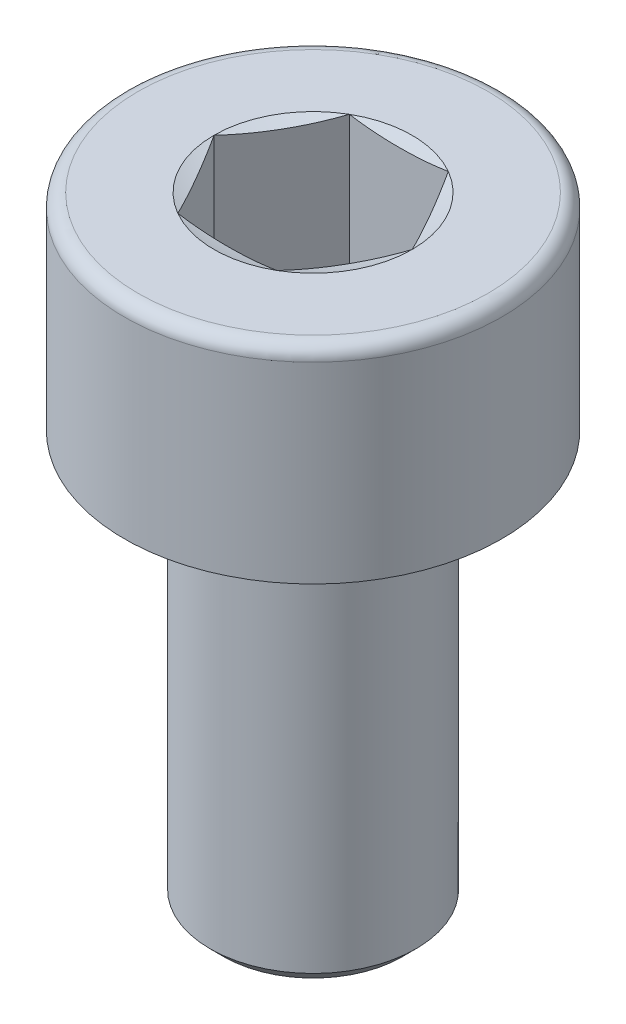
ISO-10303-21;
HEADER;
FILE_DESCRIPTION(('STEP AP214'),'2;1');
FILE_NAME('part.step','',(''),(''),'','','');
FILE_SCHEMA(('AUTOMOTIVE_DESIGN { 1 0 10303 214 1 1 1 1 }'));
ENDSEC;
DATA;
#1=APPLICATION_CONTEXT('core data for automotive mechanical design processes');
#2=APPLICATION_PROTOCOL_DEFINITION('international standard','automotive_design',2000,#1);
#3=PRODUCT_CONTEXT('',#1,'mechanical');
#4=PRODUCT('Part','Part','',(#3));
#5=PRODUCT_RELATED_PRODUCT_CATEGORY('part','',(#4));
#6=PRODUCT_DEFINITION_FORMATION('','',#4);
#7=PRODUCT_DEFINITION_CONTEXT('part definition',#1,'design');
#8=PRODUCT_DEFINITION('design','',#6,#7);
#9=PRODUCT_DEFINITION_SHAPE('','',#8);
#10=(LENGTH_UNIT() NAMED_UNIT(*) SI_UNIT(.MILLI.,.METRE.));
#11=(NAMED_UNIT(*) PLANE_ANGLE_UNIT() SI_UNIT($,.RADIAN.));
#12=(NAMED_UNIT(*) SI_UNIT($,.STERADIAN.) SOLID_ANGLE_UNIT());
#13=UNCERTAINTY_MEASURE_WITH_UNIT(LENGTH_MEASURE(1.E-05),#10,'distance_accuracy_value','');
#14=(GEOMETRIC_REPRESENTATION_CONTEXT(3) GLOBAL_UNCERTAINTY_ASSIGNED_CONTEXT((#13)) GLOBAL_UNIT_ASSIGNED_CONTEXT((#10,
#11,#12)) REPRESENTATION_CONTEXT('',''));
#15=CARTESIAN_POINT('',(0.,0.,0.));
#16=DIRECTION('',(0.,0.,1.));
#17=DIRECTION('',(1.,0.,0.));
#18=AXIS2_PLACEMENT_3D('',#15,#16,#17);
#19=CARTESIAN_POINT('',(-0.721687836487032,1.,1.25));
#20=DIRECTION('',(-0.866025403784439,0.,0.5));
#21=DIRECTION('',(0.5,0.,0.866025403784439));
#22=AXIS2_PLACEMENT_3D('',#19,#20,#21);
#23=PLANE('',#22);
#24=CARTESIAN_POINT('',(-0.721687836487033,3.,1.25));
#25=CARTESIAN_POINT('',(-0.746513124830629,2.99197238531374,1.20700133927634));
#26=CARTESIAN_POINT('',(-0.77141135372941,2.98490176746172,1.16387634180517));
#27=CARTESIAN_POINT('',(-0.821315773136171,2.97255913474823,1.07743935187044));
#28=CARTESIAN_POINT('',(-0.846321947696915,2.96728686283765,1.03412738702829));
#29=CARTESIAN_POINT('',(-0.921207679089362,2.95403550093664,0.904421495494618));
#30=CARTESIAN_POINT('',(-0.971201450687432,2.94854460534836,0.817829743024769));
#31=CARTESIAN_POINT('',(-1.05639422799085,2.94434178449894,0.670271524297353));
#32=CARTESIAN_POINT('',(-1.091578665675,2.94410115539927,0.609330290592659));
#33=CARTESIAN_POINT('',(-1.16192112047074,2.94660140173926,0.487493584957328));
#34=CARTESIAN_POINT('',(-1.19707913913524,2.94934208553123,0.426598110336958));
#35=CARTESIAN_POINT('',(-1.26754233377786,2.95799567884213,0.304552277152318));
#36=CARTESIAN_POINT('',(-1.30284686200085,2.96393024637964,0.243403040532844));
#37=CARTESIAN_POINT('',(-1.37327394982156,2.9792802908976,0.121419746198257));
#38=CARTESIAN_POINT('',(-1.40839646122585,2.98869664635053,0.0605857719566225));
#39=CARTESIAN_POINT('',(-1.44337567297406,3.,0.));
#40=B_SPLINE_CURVE_WITH_KNOTS('',3,(#24,#25,#26,#27,#28,#29,#30,#31,#32,#33,#34,#35,#36,#37,#38,
#39),.UNSPECIFIED.,.F.,.F.,(4,2,2,2,2,2,2,4),(0.,0.150861973818663,0.301702374924401,
0.601886293911623,0.812941524612172,1.02398318885367,1.23647431745907,1.44901909526101),.UNSPECIFIED.);
#41=CARTESIAN_POINT('',(-0.721687836487033,3.,1.25));
#42=VERTEX_POINT('',#41);
#43=CARTESIAN_POINT('',(-1.44337567297406,3.,0.));
#44=VERTEX_POINT('',#43);
#45=EDGE_CURVE('E81',#42,#44,#40,.T.);
#46=ORIENTED_EDGE('',*,*,#45,.F.);
#47=DIRECTION('',(0.,1.,0.));
#48=VECTOR('',#47,1.);
#49=CARTESIAN_POINT('',(-0.721687836487032,1.,1.25));
#50=LINE('',#49,#48);
#51=CARTESIAN_POINT('',(-0.721687836487032,1.,1.25));
#52=VERTEX_POINT('',#51);
#53=EDGE_CURVE('E117',#42,#52,#50,.F.);
#54=ORIENTED_EDGE('',*,*,#53,.T.);
#55=DIRECTION('',(0.5,0.,0.866025403784439));
#56=VECTOR('',#55,1.);
#57=CARTESIAN_POINT('',(-0.721687836487032,1.,1.25));
#58=LINE('',#57,#56);
#59=CARTESIAN_POINT('',(-1.44337567297406,1.,0.));
#60=VERTEX_POINT('',#59);
#61=EDGE_CURVE('E90',#60,#52,#58,.T.);
#62=ORIENTED_EDGE('',*,*,#61,.F.);
#63=DIRECTION('',(0.,1.,0.));
#64=VECTOR('',#63,1.);
#65=CARTESIAN_POINT('',(-1.44337567297406,1.,0.));
#66=LINE('',#65,#64);
#67=EDGE_CURVE('E89',#60,#44,#66,.T.);
#68=ORIENTED_EDGE('',*,*,#67,.T.);
#69=EDGE_LOOP('',(#46,#54,#62,#68));
#70=FACE_BOUND('',#69,.T.);
#71=ADVANCED_FACE('F17',(#70),#23,.F.);
#72=CARTESIAN_POINT('',(-1.44337567297406,1.,0.));
#73=DIRECTION('',(-0.866025403784439,0.,-0.5));
#74=DIRECTION('',(-0.5,0.,0.866025403784439));
#75=AXIS2_PLACEMENT_3D('',#72,#73,#74);
#76=PLANE('',#75);
#77=CARTESIAN_POINT('',(-1.44337567297406,3.,0.));
#78=CARTESIAN_POINT('',(-1.41855038463047,2.99197238531374,-0.0429986607236558));
#79=CARTESIAN_POINT('',(-1.39365215573169,2.98490176746172,-0.0861236581948247));
#80=CARTESIAN_POINT('',(-1.34374773632493,2.97255913474823,-0.172560648129561));
#81=CARTESIAN_POINT('',(-1.31874156176418,2.96728686283765,-0.215872612971707));
#82=CARTESIAN_POINT('',(-1.24385583037173,2.95403550093664,-0.345578504505382));
#83=CARTESIAN_POINT('',(-1.19386205877366,2.94854460534836,-0.432170256975232));
#84=CARTESIAN_POINT('',(-1.10866928147025,2.94434178449894,-0.579728475702647));
#85=CARTESIAN_POINT('',(-1.0734848437861,2.94410115539927,-0.640669709407341));
#86=CARTESIAN_POINT('',(-1.00314238899036,2.94660140173926,-0.762506415042673));
#87=CARTESIAN_POINT('',(-0.967984370325861,2.94934208553123,-0.823401889663042));
#88=CARTESIAN_POINT('',(-0.897521175683236,2.95799567884213,-0.945447722847683));
#89=CARTESIAN_POINT('',(-0.862216647460243,2.96393024637964,-1.00659695946716));
#90=CARTESIAN_POINT('',(-0.791789559639532,2.9792802908976,-1.12858025380174));
#91=CARTESIAN_POINT('',(-0.756667048235249,2.98869664635053,-1.18941422804338));
#92=CARTESIAN_POINT('',(-0.721687836487033,3.,-1.25));
#93=B_SPLINE_CURVE_WITH_KNOTS('',3,(#77,#78,#79,#80,#81,#82,#83,#84,#85,#86,#87,#88,#89,#90,#91,
#92),.UNSPECIFIED.,.F.,.F.,(4,2,2,2,2,2,2,4),(0.,0.150861973818663,0.301702374924401,
0.601886293911624,0.812941524612174,1.02398318885367,1.23647431745908,1.44901909526101),.UNSPECIFIED.);
#94=CARTESIAN_POINT('',(-0.721687836487031,3.,-1.25));
#95=VERTEX_POINT('',#94);
#96=EDGE_CURVE('E96',#44,#95,#93,.T.);
#97=ORIENTED_EDGE('',*,*,#96,.F.);
#98=ORIENTED_EDGE('',*,*,#67,.F.);
#99=DIRECTION('',(0.5,0.,-0.866025403784439));
#100=VECTOR('',#99,1.);
#101=CARTESIAN_POINT('',(-1.44337567297406,1.,0.));
#102=LINE('',#101,#100);
#103=CARTESIAN_POINT('',(-0.721687836487033,1.,-1.25));
#104=VERTEX_POINT('',#103);
#105=EDGE_CURVE('E228',#60,#104,#102,.T.);
#106=ORIENTED_EDGE('',*,*,#105,.T.);
#107=DIRECTION('',(0.,1.,0.));
#108=VECTOR('',#107,1.);
#109=CARTESIAN_POINT('',(-0.721687836487033,1.,-1.25));
#110=LINE('',#109,#108);
#111=EDGE_CURVE('E115',#104,#95,#110,.T.);
#112=ORIENTED_EDGE('',*,*,#111,.T.);
#113=EDGE_LOOP('',(#97,#98,#106,#112));
#114=FACE_BOUND('',#113,.T.);
#115=ADVANCED_FACE('F113',(#114),#76,.F.);
#116=CARTESIAN_POINT('',(0.721687836487032,1.,1.25));
#117=DIRECTION('',(0.,0.,1.));
#118=DIRECTION('',(1.,0.,0.));
#119=AXIS2_PLACEMENT_3D('',#116,#117,#118);
#120=PLANE('',#119);
#121=CARTESIAN_POINT('',(0.721687836487032,3.,1.25));
#122=CARTESIAN_POINT('',(0.672037259799839,2.99197238531374,1.25));
#123=CARTESIAN_POINT('',(0.622240802002277,2.98490176746172,1.25));
#124=CARTESIAN_POINT('',(0.522431963188755,2.97255913474823,1.25));
#125=CARTESIAN_POINT('',(0.472419614067266,2.96728686283765,1.25));
#126=CARTESIAN_POINT('',(0.322648151282372,2.95403550093664,1.25));
#127=CARTESIAN_POINT('',(0.222660608086233,2.94854460534836,1.25));
#128=CARTESIAN_POINT('',(0.0522750534794033,2.94434178449894,1.25));
#129=CARTESIAN_POINT('',(-0.0180938218889029,2.94410115539927,1.25));
#130=CARTESIAN_POINT('',(-0.158778731480375,2.94660140173926,1.25));
#131=CARTESIAN_POINT('',(-0.229094768809375,2.94934208553123,1.25));
#132=CARTESIAN_POINT('',(-0.370021158094624,2.95799567884213,1.25));
#133=CARTESIAN_POINT('',(-0.44063021454061,2.96393024637964,1.25));
#134=CARTESIAN_POINT('',(-0.581484390182033,2.9792802908976,1.25));
#135=CARTESIAN_POINT('',(-0.651729412990598,2.98869664635053,1.25));
#136=CARTESIAN_POINT('',(-0.721687836487032,3.,1.25));
#137=B_SPLINE_CURVE_WITH_KNOTS('',3,(#121,#122,#123,#124,#125,#126,#127,#128,#129,#130,#131,
#132,#133,#134,#135,#136),.UNSPECIFIED.,.F.,.F.,(4,2,2,2,2,2,2,4),(0.,0.150861973818663,
0.301702374924401,0.601886293911623,0.812941524612173,1.02398318885367,1.23647431745907,
1.44901909526101),.UNSPECIFIED.);
#138=CARTESIAN_POINT('',(0.72168783648703,3.,1.25));
#139=VERTEX_POINT('',#138);
#140=EDGE_CURVE('E75',#139,#42,#137,.T.);
#141=ORIENTED_EDGE('',*,*,#140,.F.);
#142=DIRECTION('',(0.,1.,0.));
#143=VECTOR('',#142,1.);
#144=CARTESIAN_POINT('',(0.721687836487031,1.,1.25));
#145=LINE('',#144,#143);
#146=CARTESIAN_POINT('',(0.721687836487032,1.,1.25));
#147=VERTEX_POINT('',#146);
#148=EDGE_CURVE('E211',#139,#147,#145,.F.);
#149=ORIENTED_EDGE('',*,*,#148,.T.);
#150=DIRECTION('',(1.,0.,0.));
#151=VECTOR('',#150,1.);
#152=CARTESIAN_POINT('',(-0.721687836487033,1.,1.25));
#153=LINE('',#152,#151);
#154=EDGE_CURVE('E232',#147,#52,#153,.F.);
#155=ORIENTED_EDGE('',*,*,#154,.T.);
#156=ORIENTED_EDGE('',*,*,#53,.F.);
#157=EDGE_LOOP('',(#141,#149,#155,#156));
#158=FACE_BOUND('',#157,.T.);
#159=ADVANCED_FACE('F138',(#158),#120,.F.);
#160=CARTESIAN_POINT('',(-0.721687836487033,1.,-1.25));
#161=DIRECTION('',(0.,-1.,0.));
#162=DIRECTION('',(0.,0.,-1.));
#163=AXIS2_PLACEMENT_3D('',#160,#161,#162);
#164=PLANE('',#163);
#165=ORIENTED_EDGE('',*,*,#61,.T.);
#166=ORIENTED_EDGE('',*,*,#154,.F.);
#167=DIRECTION('',(0.5,0.,-0.866025403784439));
#168=VECTOR('',#167,1.);
#169=CARTESIAN_POINT('',(1.44337567297406,1.,0.));
#170=LINE('',#169,#168);
#171=CARTESIAN_POINT('',(1.44337567297406,1.,0.));
#172=VERTEX_POINT('',#171);
#173=EDGE_CURVE('E160',#147,#172,#170,.T.);
#174=ORIENTED_EDGE('',*,*,#173,.T.);
#175=DIRECTION('',(-0.5,0.,-0.866025403784439));
#176=VECTOR('',#175,1.);
#177=CARTESIAN_POINT('',(0.721687836487033,1.,-1.25));
#178=LINE('',#177,#176);
#179=CARTESIAN_POINT('',(0.721687836487033,1.,-1.25));
#180=VERTEX_POINT('',#179);
#181=EDGE_CURVE('E208',#172,#180,#178,.T.);
#182=ORIENTED_EDGE('',*,*,#181,.T.);
#183=DIRECTION('',(-1.,0.,0.));
#184=VECTOR('',#183,1.);
#185=CARTESIAN_POINT('',(-0.721687836487033,1.,-1.25));
#186=LINE('',#185,#184);
#187=EDGE_CURVE('E223',#180,#104,#186,.T.);
#188=ORIENTED_EDGE('',*,*,#187,.T.);
#189=ORIENTED_EDGE('',*,*,#105,.F.);
#190=EDGE_LOOP('',(#165,#166,#174,#182,#188,#189));
#191=FACE_BOUND('',#190,.T.);
#192=ADVANCED_FACE('F142',(#191),#164,.F.);
#193=CARTESIAN_POINT('',(-0.721687836487033,1.,-1.25));
#194=DIRECTION('',(0.,0.,-1.));
#195=DIRECTION('',(-1.,0.,0.));
#196=AXIS2_PLACEMENT_3D('',#193,#194,#195);
#197=PLANE('',#196);
#198=CARTESIAN_POINT('',(-0.721687836487031,3.,-1.25));
#199=CARTESIAN_POINT('',(-0.672037259799838,2.99197238531374,-1.25));
#200=CARTESIAN_POINT('',(-0.622240802002276,2.98490176746172,-1.25));
#201=CARTESIAN_POINT('',(-0.522431963188754,2.97255913474823,-1.25));
#202=CARTESIAN_POINT('',(-0.472419614067265,2.96728686283765,-1.25));
#203=CARTESIAN_POINT('',(-0.322648151282371,2.95403550093664,-1.25));
#204=CARTESIAN_POINT('',(-0.222660608086232,2.94854460534836,-1.25));
#205=CARTESIAN_POINT('',(-0.0522750534794021,2.94434178449894,-1.25));
#206=CARTESIAN_POINT('',(0.0180938218889041,2.94410115539927,-1.25));
#207=CARTESIAN_POINT('',(0.158778731480376,2.94660140173926,-1.25));
#208=CARTESIAN_POINT('',(0.229094768809376,2.94934208553123,-1.25));
#209=CARTESIAN_POINT('',(0.370021158094625,2.95799567884213,-1.25));
#210=CARTESIAN_POINT('',(0.440630214540611,2.96393024637964,-1.25));
#211=CARTESIAN_POINT('',(0.581484390182035,2.9792802908976,-1.25));
#212=CARTESIAN_POINT('',(0.651729412990599,2.98869664635053,-1.25));
#213=CARTESIAN_POINT('',(0.721687836487033,3.,-1.25));
#214=B_SPLINE_CURVE_WITH_KNOTS('',3,(#198,#199,#200,#201,#202,#203,#204,#205,#206,#207,#208,
#209,#210,#211,#212,#213),.UNSPECIFIED.,.F.,.F.,(4,2,2,2,2,2,2,4),(0.,0.150861973818663,
0.301702374924401,0.601886293911623,0.812941524612173,1.02398318885367,1.23647431745907,
1.44901909526101),.UNSPECIFIED.);
#215=CARTESIAN_POINT('',(0.721687836487033,3.,-1.25));
#216=VERTEX_POINT('',#215);
#217=EDGE_CURVE('E155',#95,#216,#214,.T.);
#218=ORIENTED_EDGE('',*,*,#217,.F.);
#219=ORIENTED_EDGE('',*,*,#111,.F.);
#220=ORIENTED_EDGE('',*,*,#187,.F.);
#221=DIRECTION('',(0.,1.,0.));
#222=VECTOR('',#221,1.);
#223=CARTESIAN_POINT('',(0.721687836487033,1.,-1.25));
#224=LINE('',#223,#222);
#225=EDGE_CURVE('E203',#180,#216,#224,.T.);
#226=ORIENTED_EDGE('',*,*,#225,.T.);
#227=EDGE_LOOP('',(#218,#219,#220,#226));
#228=FACE_BOUND('',#227,.T.);
#229=ADVANCED_FACE('F146',(#228),#197,.F.);
#230=CARTESIAN_POINT('',(1.44337567297406,1.,0.));
#231=DIRECTION('',(0.866025403784439,0.,0.5));
#232=DIRECTION('',(0.5,0.,-0.866025403784439));
#233=AXIS2_PLACEMENT_3D('',#230,#231,#232);
#234=PLANE('',#233);
#235=CARTESIAN_POINT('',(1.44337567297406,3.,0.));
#236=CARTESIAN_POINT('',(1.41855038463047,2.99197238531374,0.0429986607236575));
#237=CARTESIAN_POINT('',(1.39365215573169,2.98490176746172,0.0861236581948263));
#238=CARTESIAN_POINT('',(1.34374773632493,2.97255913474823,0.172560648129562));
#239=CARTESIAN_POINT('',(1.31874156176418,2.96728686283765,0.215872612971708));
#240=CARTESIAN_POINT('',(1.24385583037173,2.95403550093664,0.345578504505383));
#241=CARTESIAN_POINT('',(1.19386205877366,2.94854460534836,0.432170256975233));
#242=CARTESIAN_POINT('',(1.10866928147025,2.94434178449894,0.579728475702648));
#243=CARTESIAN_POINT('',(1.0734848437861,2.94410115539927,0.640669709407342));
#244=CARTESIAN_POINT('',(1.00314238899036,2.94660140173926,0.762506415042673));
#245=CARTESIAN_POINT('',(0.96798437032586,2.94934208553123,0.823401889663042));
#246=CARTESIAN_POINT('',(0.897521175683236,2.95799567884213,0.945447722847683));
#247=CARTESIAN_POINT('',(0.862216647460243,2.96393024637964,1.00659695946716));
#248=CARTESIAN_POINT('',(0.791789559639532,2.9792802908976,1.12858025380174));
#249=CARTESIAN_POINT('',(0.756667048235249,2.98869664635053,1.18941422804338));
#250=CARTESIAN_POINT('',(0.721687836487032,3.,1.25));
#251=B_SPLINE_CURVE_WITH_KNOTS('',3,(#235,#236,#237,#238,#239,#240,#241,#242,#243,#244,#245,
#246,#247,#248,#249,#250),.UNSPECIFIED.,.F.,.F.,(4,2,2,2,2,2,2,4),(0.,0.150861973818663,
0.301702374924401,0.601886293911623,0.812941524612172,1.02398318885367,1.23647431745907,
1.449019095261),.UNSPECIFIED.);
#252=CARTESIAN_POINT('',(1.44337567297406,3.,0.));
#253=VERTEX_POINT('',#252);
#254=EDGE_CURVE('E161',#253,#139,#251,.T.);
#255=ORIENTED_EDGE('',*,*,#254,.F.);
#256=DIRECTION('',(0.,1.,0.));
#257=VECTOR('',#256,1.);
#258=CARTESIAN_POINT('',(1.44337567297407,1.,0.));
#259=LINE('',#258,#257);
#260=EDGE_CURVE('E199',#253,#172,#259,.F.);
#261=ORIENTED_EDGE('',*,*,#260,.T.);
#262=ORIENTED_EDGE('',*,*,#173,.F.);
#263=ORIENTED_EDGE('',*,*,#148,.F.);
#264=EDGE_LOOP('',(#255,#261,#262,#263));
#265=FACE_BOUND('',#264,.T.);
#266=ADVANCED_FACE('F151',(#265),#234,.F.);
#267=CARTESIAN_POINT('',(0.721687836487033,1.,-1.25));
#268=DIRECTION('',(0.866025403784439,0.,-0.5));
#269=DIRECTION('',(-0.5,0.,-0.866025403784439));
#270=AXIS2_PLACEMENT_3D('',#267,#268,#269);
#271=PLANE('',#270);
#272=CARTESIAN_POINT('',(1.44337567297407,3.,0.));
#273=CARTESIAN_POINT('',(1.41855038463047,2.99197238531374,-0.0429986607236545));
#274=CARTESIAN_POINT('',(1.39365215573169,2.98490176746172,-0.0861236581948233));
#275=CARTESIAN_POINT('',(1.34374773632493,2.97255913474823,-0.172560648129559));
#276=CARTESIAN_POINT('',(1.31874156176418,2.96728686283765,-0.215872612971705));
#277=CARTESIAN_POINT('',(1.24385583037174,2.95403550093664,-0.34557850450538));
#278=CARTESIAN_POINT('',(1.19386205877367,2.94854460534836,-0.43217025697523));
#279=CARTESIAN_POINT('',(1.10866928147025,2.94434178449894,-0.579728475702645));
#280=CARTESIAN_POINT('',(1.0734848437861,2.94410115539927,-0.640669709407339));
#281=CARTESIAN_POINT('',(1.00314238899036,2.94660140173926,-0.76250641504267));
#282=CARTESIAN_POINT('',(0.967984370325862,2.94934208553123,-0.82340188966304));
#283=CARTESIAN_POINT('',(0.897521175683238,2.95799567884213,-0.945447722847681));
#284=CARTESIAN_POINT('',(0.862216647460245,2.96393024637964,-1.00659695946715));
#285=CARTESIAN_POINT('',(0.791789559639533,2.9792802908976,-1.12858025380174));
#286=CARTESIAN_POINT('',(0.756667048235251,2.98869664635053,-1.18941422804338));
#287=CARTESIAN_POINT('',(0.721687836487034,3.,-1.25));
#288=B_SPLINE_CURVE_WITH_KNOTS('',3,(#272,#273,#274,#275,#276,#277,#278,#279,#280,#281,#282,
#283,#284,#285,#286,#287),.UNSPECIFIED.,.F.,.F.,(4,2,2,2,2,2,2,4),(0.,0.150861973818663,
0.301702374924401,0.601886293911622,0.812941524612173,1.02398318885367,1.23647431745907,
1.44901909526101),.UNSPECIFIED.);
#289=EDGE_CURVE('E202',#253,#216,#288,.T.);
#290=ORIENTED_EDGE('',*,*,#289,.T.);
#291=ORIENTED_EDGE('',*,*,#225,.F.);
#292=ORIENTED_EDGE('',*,*,#181,.F.);
#293=ORIENTED_EDGE('',*,*,#260,.F.);
#294=EDGE_LOOP('',(#290,#291,#292,#293));
#295=FACE_BOUND('',#294,.T.);
#296=ADVANCED_FACE('F194',(#295),#271,.F.);
#297=CARTESIAN_POINT('',(-0.520457544102291,5.85450908693594,0.));
#298=DIRECTION('',(0.,0.,1.));
#299=DIRECTION('',(-1.,0.,0.));
#300=AXIS2_PLACEMENT_3D('',#297,#298,#299);
#301=CIRCLE('',#300,3.);
#302=TRIMMED_CURVE('',#301,(PARAMETER_VALUE(-1.74516442055986)),
(PARAMETER_VALUE(1.74516442055986)),.T.,.PARAMETER.);
#303=CARTESIAN_POINT('',(0.,5.85450908693594,0.));
#304=DIRECTION('',(0.,1.,0.));
#305=AXIS1_PLACEMENT('',#303,#304);
#306=SURFACE_OF_REVOLUTION('',#302,#305);
#307=ORIENTED_EDGE('',*,*,#254,.T.);
#308=CARTESIAN_POINT('',(0.,3.,0.));
#309=DIRECTION('',(0.,1.,0.));
#310=DIRECTION('',(-1.,0.,0.));
#311=AXIS2_PLACEMENT_3D('',#308,#309,#310);
#312=CIRCLE('',#311,1.44337567297406);
#313=EDGE_CURVE('E259',#253,#139,#312,.F.);
#314=ORIENTED_EDGE('',*,*,#313,.F.);
#315=EDGE_LOOP('',(#307,#314));
#316=FACE_BOUND('',#315,.T.);
#317=ADVANCED_FACE('F191',(#316),#306,.T.);
#318=CARTESIAN_POINT('',(-0.520457544102291,5.85450908693594,0.));
#319=DIRECTION('',(0.,0.,1.));
#320=DIRECTION('',(-1.,0.,0.));
#321=AXIS2_PLACEMENT_3D('',#318,#319,#320);
#322=CIRCLE('',#321,3.);
#323=TRIMMED_CURVE('',#322,(PARAMETER_VALUE(-1.74516442055986)),
(PARAMETER_VALUE(1.74516442055986)),.T.,.PARAMETER.);
#324=CARTESIAN_POINT('',(0.,5.85450908693594,0.));
#325=DIRECTION('',(0.,1.,0.));
#326=AXIS1_PLACEMENT('',#324,#325);
#327=SURFACE_OF_REVOLUTION('',#323,#326);
#328=ORIENTED_EDGE('',*,*,#140,.T.);
#329=CARTESIAN_POINT('',(0.,3.,0.));
#330=DIRECTION('',(0.,1.,0.));
#331=DIRECTION('',(-1.,0.,0.));
#332=AXIS2_PLACEMENT_3D('',#329,#330,#331);
#333=CIRCLE('',#332,1.44337567297406);
#334=EDGE_CURVE('E106',#139,#42,#333,.F.);
#335=ORIENTED_EDGE('',*,*,#334,.F.);
#336=EDGE_LOOP('',(#328,#335));
#337=FACE_BOUND('',#336,.T.);
#338=ADVANCED_FACE('F188',(#337),#327,.T.);
#339=CARTESIAN_POINT('',(-0.520457544102291,5.85450908693594,0.));
#340=DIRECTION('',(0.,0.,1.));
#341=DIRECTION('',(-1.,0.,0.));
#342=AXIS2_PLACEMENT_3D('',#339,#340,#341);
#343=CIRCLE('',#342,3.);
#344=TRIMMED_CURVE('',#343,(PARAMETER_VALUE(-1.74516442055986)),
(PARAMETER_VALUE(1.74516442055986)),.T.,.PARAMETER.);
#345=CARTESIAN_POINT('',(0.,5.85450908693594,0.));
#346=DIRECTION('',(0.,1.,0.));
#347=AXIS1_PLACEMENT('',#345,#346);
#348=SURFACE_OF_REVOLUTION('',#344,#347);
#349=ORIENTED_EDGE('',*,*,#45,.T.);
#350=CARTESIAN_POINT('',(0.,3.,0.));
#351=DIRECTION('',(0.,1.,0.));
#352=DIRECTION('',(-1.,0.,0.));
#353=AXIS2_PLACEMENT_3D('',#350,#351,#352);
#354=CIRCLE('',#353,1.44337567297406);
#355=EDGE_CURVE('E85',#42,#44,#354,.F.);
#356=ORIENTED_EDGE('',*,*,#355,.F.);
#357=EDGE_LOOP('',(#349,#356));
#358=FACE_BOUND('',#357,.T.);
#359=ADVANCED_FACE('F83',(#358),#348,.T.);
#360=CARTESIAN_POINT('',(-0.520457544102291,5.85450908693594,0.));
#361=DIRECTION('',(0.,0.,1.));
#362=DIRECTION('',(-1.,0.,0.));
#363=AXIS2_PLACEMENT_3D('',#360,#361,#362);
#364=CIRCLE('',#363,3.);
#365=TRIMMED_CURVE('',#364,(PARAMETER_VALUE(-1.74516442055986)),
(PARAMETER_VALUE(1.74516442055986)),.T.,.PARAMETER.);
#366=CARTESIAN_POINT('',(0.,5.85450908693594,0.));
#367=DIRECTION('',(0.,1.,0.));
#368=AXIS1_PLACEMENT('',#366,#367);
#369=SURFACE_OF_REVOLUTION('',#365,#368);
#370=ORIENTED_EDGE('',*,*,#96,.T.);
#371=CARTESIAN_POINT('',(0.,3.,0.));
#372=DIRECTION('',(0.,1.,0.));
#373=DIRECTION('',(-1.,0.,0.));
#374=AXIS2_PLACEMENT_3D('',#371,#372,#373);
#375=CIRCLE('',#374,1.44337567297406);
#376=EDGE_CURVE('E103',#44,#95,#375,.F.);
#377=ORIENTED_EDGE('',*,*,#376,.F.);
#378=EDGE_LOOP('',(#370,#377));
#379=FACE_BOUND('',#378,.T.);
#380=ADVANCED_FACE('F109',(#379),#369,.T.);
#381=CARTESIAN_POINT('',(-0.520457544102291,5.85450908693594,0.));
#382=DIRECTION('',(0.,0.,1.));
#383=DIRECTION('',(-1.,0.,0.));
#384=AXIS2_PLACEMENT_3D('',#381,#382,#383);
#385=CIRCLE('',#384,3.);
#386=TRIMMED_CURVE('',#385,(PARAMETER_VALUE(-1.74516442055986)),
(PARAMETER_VALUE(1.74516442055986)),.T.,.PARAMETER.);
#387=CARTESIAN_POINT('',(0.,5.85450908693594,0.));
#388=DIRECTION('',(0.,1.,0.));
#389=AXIS1_PLACEMENT('',#387,#388);
#390=SURFACE_OF_REVOLUTION('',#386,#389);
#391=ORIENTED_EDGE('',*,*,#217,.T.);
#392=CARTESIAN_POINT('',(0.,3.,0.));
#393=DIRECTION('',(0.,1.,0.));
#394=DIRECTION('',(-1.,0.,0.));
#395=AXIS2_PLACEMENT_3D('',#392,#393,#394);
#396=CIRCLE('',#395,1.44337567297406);
#397=EDGE_CURVE('E111',#95,#216,#396,.F.);
#398=ORIENTED_EDGE('',*,*,#397,.F.);
#399=EDGE_LOOP('',(#391,#398));
#400=FACE_BOUND('',#399,.T.);
#401=ADVANCED_FACE('F167',(#400),#390,.T.);
#402=CARTESIAN_POINT('',(-0.520457544102291,5.85450908693594,0.));
#403=DIRECTION('',(0.,0.,1.));
#404=DIRECTION('',(-1.,0.,0.));
#405=AXIS2_PLACEMENT_3D('',#402,#403,#404);
#406=CIRCLE('',#405,3.);
#407=TRIMMED_CURVE('',#406,(PARAMETER_VALUE(-1.74516442055986)),
(PARAMETER_VALUE(1.74516442055986)),.T.,.PARAMETER.);
#408=CARTESIAN_POINT('',(0.,5.85450908693594,0.));
#409=DIRECTION('',(0.,1.,0.));
#410=AXIS1_PLACEMENT('',#408,#409);
#411=SURFACE_OF_REVOLUTION('',#407,#410);
#412=ORIENTED_EDGE('',*,*,#289,.F.);
#413=CARTESIAN_POINT('',(0.,3.,0.));
#414=DIRECTION('',(0.,1.,0.));
#415=DIRECTION('',(-1.,0.,0.));
#416=AXIS2_PLACEMENT_3D('',#413,#414,#415);
#417=CIRCLE('',#416,1.44337567297406);
#418=EDGE_CURVE('E254',#216,#253,#417,.F.);
#419=ORIENTED_EDGE('',*,*,#418,.F.);
#420=EDGE_LOOP('',(#412,#419));
#421=FACE_BOUND('',#420,.T.);
#422=ADVANCED_FACE('F172',(#421),#411,.T.);
#423=CARTESIAN_POINT('',(0.,3.,0.));
#424=DIRECTION('',(0.,1.,0.));
#425=DIRECTION('',(0.,0.,1.));
#426=AXIS2_PLACEMENT_3D('',#423,#424,#425);
#427=PLANE('',#426);
#428=CARTESIAN_POINT('',(0.,3.,0.));
#429=DIRECTION('',(0.,-1.,0.));
#430=DIRECTION('',(0.,0.,-1.));
#431=AXIS2_PLACEMENT_3D('',#428,#429,#430);
#432=CIRCLE('',#431,2.55);
#433=CARTESIAN_POINT('',(0.,3.,-2.55));
#434=VERTEX_POINT('',#433);
#435=CARTESIAN_POINT('',(0.,3.,2.55));
#436=VERTEX_POINT('',#435);
#437=EDGE_CURVE('E37',#434,#436,#432,.T.);
#438=ORIENTED_EDGE('',*,*,#437,.F.);
#439=CARTESIAN_POINT('',(0.,3.,0.));
#440=DIRECTION('',(0.,-1.,0.));
#441=DIRECTION('',(0.,0.,1.));
#442=AXIS2_PLACEMENT_3D('',#439,#440,#441);
#443=CIRCLE('',#442,2.55);
#444=EDGE_CURVE('E327',#436,#434,#443,.T.);
#445=ORIENTED_EDGE('',*,*,#444,.F.);
#446=EDGE_LOOP('',(#438,#445));
#447=FACE_BOUND('',#446,.T.);
#448=ORIENTED_EDGE('',*,*,#397,.T.);
#449=ORIENTED_EDGE('',*,*,#418,.T.);
#450=ORIENTED_EDGE('',*,*,#313,.T.);
#451=ORIENTED_EDGE('',*,*,#334,.T.);
#452=ORIENTED_EDGE('',*,*,#355,.T.);
#453=ORIENTED_EDGE('',*,*,#376,.T.);
#454=EDGE_LOOP('',(#448,#449,#450,#451,#452,#453));
#455=FACE_BOUND('',#454,.T.);
#456=ADVANCED_FACE('F102',(#447,#455),#427,.T.);
#457=CARTESIAN_POINT('',(0.,2.8,0.));
#458=DIRECTION('',(0.,1.,0.));
#459=DIRECTION('',(0.,0.,1.));
#460=AXIS2_PLACEMENT_3D('',#457,#458,#459);
#461=TOROIDAL_SURFACE('',#460,2.55,0.2);
#462=CARTESIAN_POINT('',(0.,2.8,0.));
#463=DIRECTION('',(0.,-1.,0.));
#464=DIRECTION('',(0.,0.,-1.));
#465=AXIS2_PLACEMENT_3D('',#462,#463,#464);
#466=CIRCLE('',#465,2.75);
#467=CARTESIAN_POINT('',(0.,2.8,-2.75));
#468=VERTEX_POINT('',#467);
#469=EDGE_CURVE('E253',#468,#468,#466,.T.);
#470=ORIENTED_EDGE('',*,*,#469,.F.);
#471=EDGE_LOOP('',(#470));
#472=FACE_BOUND('',#471,.T.);
#473=ORIENTED_EDGE('',*,*,#444,.T.);
#474=ORIENTED_EDGE('',*,*,#437,.T.);
#475=EDGE_LOOP('',(#473,#474));
#476=FACE_BOUND('',#475,.T.);
#477=ADVANCED_FACE('F304',(#472,#476),#461,.T.);
#478=CARTESIAN_POINT('',(0.,-6.,0.));
#479=DIRECTION('',(0.,-1.,0.));
#480=DIRECTION('',(0.,0.,-1.));
#481=AXIS2_PLACEMENT_3D('',#478,#479,#480);
#482=PLANE('',#481);
#483=CARTESIAN_POINT('',(0.,-5.99999999997181,0.));
#484=DIRECTION('',(0.,1.,0.));
#485=DIRECTION('',(0.,0.,1.));
#486=AXIS2_PLACEMENT_3D('',#483,#484,#485);
#487=CIRCLE('',#486,1.29999999995789);
#488=CARTESIAN_POINT('',(0.,-5.99999999997181,1.29999999995789));
#489=VERTEX_POINT('',#488);
#490=EDGE_CURVE('E250',#489,#489,#487,.T.);
#491=ORIENTED_EDGE('',*,*,#490,.F.);
#492=EDGE_LOOP('',(#491));
#493=FACE_BOUND('',#492,.T.);
#494=ADVANCED_FACE('F301',(#493),#482,.T.);
#495=CARTESIAN_POINT('',(0.,3.,0.));
#496=DIRECTION('',(0.,-1.,0.));
#497=DIRECTION('',(0.,0.,-1.));
#498=AXIS2_PLACEMENT_3D('',#495,#496,#497);
#499=CYLINDRICAL_SURFACE('',#498,2.75);
#500=ORIENTED_EDGE('',*,*,#469,.T.);
#501=EDGE_LOOP('',(#500));
#502=FACE_BOUND('',#501,.T.);
#503=CARTESIAN_POINT('',(0.,0.,0.));
#504=DIRECTION('',(0.,-1.,0.));
#505=DIRECTION('',(0.,0.,-1.));
#506=AXIS2_PLACEMENT_3D('',#503,#504,#505);
#507=CIRCLE('',#506,2.75);
#508=CARTESIAN_POINT('',(0.,0.,-2.75));
#509=VERTEX_POINT('',#508);
#510=EDGE_CURVE('E247',#509,#509,#507,.F.);
#511=ORIENTED_EDGE('',*,*,#510,.T.);
#512=EDGE_LOOP('',(#511));
#513=FACE_BOUND('',#512,.T.);
#514=ADVANCED_FACE('F297',(#502,#513),#499,.T.);
#515=CARTESIAN_POINT('',(0.,-5.80000000002201,0.));
#516=DIRECTION('',(0.,1.,0.));
#517=DIRECTION('',(0.,0.,1.));
#518=AXIS2_PLACEMENT_3D('',#515,#516,#517);
#519=CONICAL_SURFACE('',#518,1.49999999990769,0.785398163397448);
#520=CARTESIAN_POINT('',(0.,-5.8,0.));
#521=DIRECTION('',(0.,1.,0.));
#522=DIRECTION('',(0.,0.,1.));
#523=AXIS2_PLACEMENT_3D('',#520,#521,#522);
#524=CIRCLE('',#523,1.5);
#525=CARTESIAN_POINT('',(0.,-5.8,1.5));
#526=VERTEX_POINT('',#525);
#527=EDGE_CURVE('E29',#526,#526,#524,.T.);
#528=ORIENTED_EDGE('',*,*,#527,.F.);
#529=EDGE_LOOP('',(#528));
#530=FACE_BOUND('',#529,.T.);
#531=ORIENTED_EDGE('',*,*,#490,.T.);
#532=EDGE_LOOP('',(#531));
#533=FACE_BOUND('',#532,.T.);
#534=ADVANCED_FACE('F290',(#530,#533),#519,.T.);
#535=CARTESIAN_POINT('',(0.,0.,0.));
#536=DIRECTION('',(0.,1.,0.));
#537=DIRECTION('',(0.,0.,1.));
#538=AXIS2_PLACEMENT_3D('',#535,#536,#537);
#539=PLANE('',#538);
#540=CARTESIAN_POINT('',(0.,0.,0.));
#541=DIRECTION('',(0.,1.,0.));
#542=DIRECTION('',(0.,0.,1.));
#543=AXIS2_PLACEMENT_3D('',#540,#541,#542);
#544=CIRCLE('',#543,1.5);
#545=CARTESIAN_POINT('',(0.,0.,1.5));
#546=VERTEX_POINT('',#545);
#547=EDGE_CURVE('E11',#546,#546,#544,.F.);
#548=ORIENTED_EDGE('',*,*,#547,.F.);
#549=EDGE_LOOP('',(#548));
#550=FACE_BOUND('',#549,.T.);
#551=ORIENTED_EDGE('',*,*,#510,.F.);
#552=EDGE_LOOP('',(#551));
#553=FACE_BOUND('',#552,.T.);
#554=ADVANCED_FACE('F284',(#550,#553),#539,.F.);
#555=CARTESIAN_POINT('',(0.,-6.,0.));
#556=DIRECTION('',(0.,1.,0.));
#557=DIRECTION('',(0.,0.,1.));
#558=AXIS2_PLACEMENT_3D('',#555,#556,#557);
#559=CYLINDRICAL_SURFACE('',#558,1.5);
#560=ORIENTED_EDGE('',*,*,#547,.T.);
#561=EDGE_LOOP('',(#560));
#562=FACE_BOUND('',#561,.T.);
#563=ORIENTED_EDGE('',*,*,#527,.T.);
#564=EDGE_LOOP('',(#563));
#565=FACE_BOUND('',#564,.T.);
#566=ADVANCED_FACE('F282',(#562,#565),#559,.T.);
#567=CLOSED_SHELL('',(#71,#115,#159,#192,#229,#266,#296,#317,#338,#359,#380,#401,#422,#456,#477,
#494,#514,#534,#554,#566));
#568=MANIFOLD_SOLID_BREP('B1',#567);
#569=ADVANCED_BREP_SHAPE_REPRESENTATION('',(#18,#568),#14);
#570=SHAPE_DEFINITION_REPRESENTATION(#9,#569);
ENDSEC;
END-ISO-10303-21;
